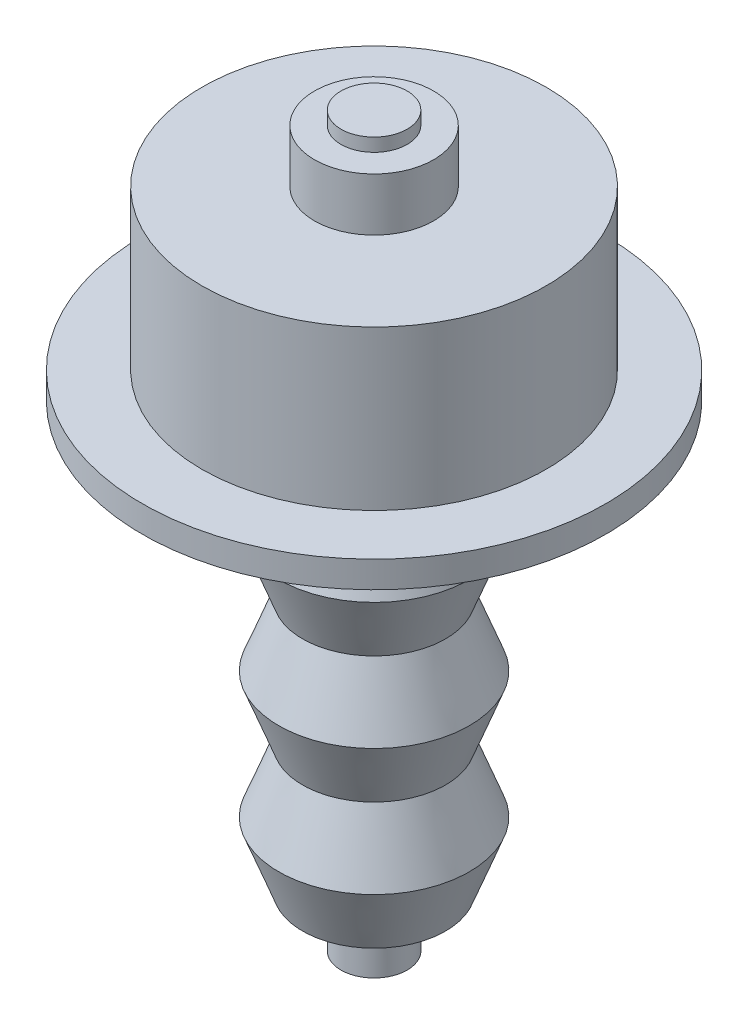
ISO-10303-21;
HEADER;
FILE_DESCRIPTION(('STEP AP214'),'2;1');
FILE_NAME('part.step','',(''),(''),'','','');
FILE_SCHEMA(('AUTOMOTIVE_DESIGN { 1 0 10303 214 1 1 1 1 }'));
ENDSEC;
DATA;
#1=APPLICATION_CONTEXT('core data for automotive mechanical design processes');
#2=APPLICATION_PROTOCOL_DEFINITION('international standard','automotive_design',2000,#1);
#3=PRODUCT_CONTEXT('',#1,'mechanical');
#4=PRODUCT('Part','Part','',(#3));
#5=PRODUCT_RELATED_PRODUCT_CATEGORY('part','',(#4));
#6=PRODUCT_DEFINITION_FORMATION('','',#4);
#7=PRODUCT_DEFINITION_CONTEXT('part definition',#1,'design');
#8=PRODUCT_DEFINITION('design','',#6,#7);
#9=PRODUCT_DEFINITION_SHAPE('','',#8);
#10=(LENGTH_UNIT() NAMED_UNIT(*) SI_UNIT(.MILLI.,.METRE.));
#11=(NAMED_UNIT(*) PLANE_ANGLE_UNIT() SI_UNIT($,.RADIAN.));
#12=(NAMED_UNIT(*) SI_UNIT($,.STERADIAN.) SOLID_ANGLE_UNIT());
#13=UNCERTAINTY_MEASURE_WITH_UNIT(LENGTH_MEASURE(1.E-05),#10,'distance_accuracy_value','');
#14=(GEOMETRIC_REPRESENTATION_CONTEXT(3) GLOBAL_UNCERTAINTY_ASSIGNED_CONTEXT((#13)) GLOBAL_UNIT_ASSIGNED_CONTEXT((#10,
#11,#12)) REPRESENTATION_CONTEXT('',''));
#15=CARTESIAN_POINT('',(0.,0.,0.));
#16=DIRECTION('',(0.,0.,1.));
#17=DIRECTION('',(1.,0.,0.));
#18=AXIS2_PLACEMENT_3D('',#15,#16,#17);
#19=CARTESIAN_POINT('',(0.,4.,0.));
#20=DIRECTION('',(0.,-1.,0.));
#21=DIRECTION('',(0.,0.,-1.));
#22=AXIS2_PLACEMENT_3D('',#19,#20,#21);
#23=PLANE('',#22);
#24=CARTESIAN_POINT('',(0.,4.,0.));
#25=DIRECTION('',(0.,-1.,0.));
#26=DIRECTION('',(0.,0.,-1.));
#27=AXIS2_PLACEMENT_3D('',#24,#25,#26);
#28=CIRCLE('',#27,2.5);
#29=CARTESIAN_POINT('',(0.,4.,-2.5));
#30=VERTEX_POINT('',#29);
#31=EDGE_CURVE('E73',#30,#30,#28,.F.);
#32=ORIENTED_EDGE('',*,*,#31,.T.);
#33=EDGE_LOOP('',(#32));
#34=FACE_BOUND('',#33,.T.);
#35=CARTESIAN_POINT('',(0.,4.,0.));
#36=DIRECTION('',(0.,-1.,0.));
#37=DIRECTION('',(0.,0.,-1.));
#38=AXIS2_PLACEMENT_3D('',#35,#36,#37);
#39=CIRCLE('',#38,5.4);
#40=CARTESIAN_POINT('',(0.,4.,-5.4));
#41=VERTEX_POINT('',#40);
#42=EDGE_CURVE('E10',#41,#41,#39,.T.);
#43=ORIENTED_EDGE('',*,*,#42,.T.);
#44=EDGE_LOOP('',(#43));
#45=FACE_BOUND('',#44,.T.);
#46=ADVANCED_FACE('F41',(#34,#45),#23,.T.);
#47=CARTESIAN_POINT('',(0.,4.,0.));
#48=DIRECTION('',(0.,1.,0.));
#49=DIRECTION('',(0.,0.,1.));
#50=AXIS2_PLACEMENT_3D('',#47,#48,#49);
#51=CONICAL_SURFACE('',#50,5.4,0.360283597779354);
#52=CARTESIAN_POINT('',(0.,8.778,0.));
#53=DIRECTION('',(0.,-1.,0.));
#54=DIRECTION('',(0.,0.,-1.));
#55=AXIS2_PLACEMENT_3D('',#52,#53,#54);
#56=CIRCLE('',#55,7.2);
#57=CARTESIAN_POINT('',(0.,8.778,-7.2));
#58=VERTEX_POINT('',#57);
#59=EDGE_CURVE('E48',#58,#58,#56,.T.);
#60=ORIENTED_EDGE('',*,*,#59,.T.);
#61=EDGE_LOOP('',(#60));
#62=FACE_BOUND('',#61,.T.);
#63=ORIENTED_EDGE('',*,*,#42,.F.);
#64=EDGE_LOOP('',(#63));
#65=FACE_BOUND('',#64,.T.);
#66=ADVANCED_FACE('F135',(#62,#65),#51,.T.);
#67=CARTESIAN_POINT('',(0.,8.778,0.));
#68=DIRECTION('',(0.,-1.,0.));
#69=DIRECTION('',(0.,0.,-1.));
#70=AXIS2_PLACEMENT_3D('',#67,#68,#69);
#71=CONICAL_SURFACE('',#70,7.2,0.360283597779354);
#72=CARTESIAN_POINT('',(0.,13.556,0.));
#73=DIRECTION('',(0.,-1.,0.));
#74=DIRECTION('',(0.,0.,-1.));
#75=AXIS2_PLACEMENT_3D('',#72,#73,#74);
#76=CIRCLE('',#75,5.4);
#77=CARTESIAN_POINT('',(0.,13.556,-5.4));
#78=VERTEX_POINT('',#77);
#79=EDGE_CURVE('E55',#78,#78,#76,.T.);
#80=ORIENTED_EDGE('',*,*,#79,.T.);
#81=EDGE_LOOP('',(#80));
#82=FACE_BOUND('',#81,.T.);
#83=ORIENTED_EDGE('',*,*,#59,.F.);
#84=EDGE_LOOP('',(#83));
#85=FACE_BOUND('',#84,.T.);
#86=ADVANCED_FACE('F139',(#82,#85),#71,.T.);
#87=CARTESIAN_POINT('',(0.,13.556,0.));
#88=DIRECTION('',(0.,1.,0.));
#89=DIRECTION('',(0.,0.,1.));
#90=AXIS2_PLACEMENT_3D('',#87,#88,#89);
#91=CONICAL_SURFACE('',#90,5.4,0.360352657212022);
#92=CARTESIAN_POINT('',(0.,18.333,0.));
#93=DIRECTION('',(0.,-1.,0.));
#94=DIRECTION('',(0.,0.,-1.));
#95=AXIS2_PLACEMENT_3D('',#92,#93,#94);
#96=CIRCLE('',#95,7.2);
#97=CARTESIAN_POINT('',(0.,18.333,-7.2));
#98=VERTEX_POINT('',#97);
#99=EDGE_CURVE('E60',#98,#98,#96,.T.);
#100=ORIENTED_EDGE('',*,*,#99,.T.);
#101=EDGE_LOOP('',(#100));
#102=FACE_BOUND('',#101,.T.);
#103=ORIENTED_EDGE('',*,*,#79,.F.);
#104=EDGE_LOOP('',(#103));
#105=FACE_BOUND('',#104,.T.);
#106=ADVANCED_FACE('F184',(#102,#105),#91,.T.);
#107=CARTESIAN_POINT('',(0.,18.333,0.));
#108=DIRECTION('',(0.,-1.,0.));
#109=DIRECTION('',(0.,0.,-1.));
#110=AXIS2_PLACEMENT_3D('',#107,#108,#109);
#111=CONICAL_SURFACE('',#110,7.2,0.360283597779354);
#112=CARTESIAN_POINT('',(0.,23.111,0.));
#113=DIRECTION('',(0.,-1.,0.));
#114=DIRECTION('',(0.,0.,-1.));
#115=AXIS2_PLACEMENT_3D('',#112,#113,#114);
#116=CIRCLE('',#115,5.4);
#117=CARTESIAN_POINT('',(0.,23.111,-5.4));
#118=VERTEX_POINT('',#117);
#119=EDGE_CURVE('E58',#118,#118,#116,.T.);
#120=ORIENTED_EDGE('',*,*,#119,.T.);
#121=EDGE_LOOP('',(#120));
#122=FACE_BOUND('',#121,.T.);
#123=ORIENTED_EDGE('',*,*,#99,.F.);
#124=EDGE_LOOP('',(#123));
#125=FACE_BOUND('',#124,.T.);
#126=ADVANCED_FACE('F180',(#122,#125),#111,.T.);
#127=CARTESIAN_POINT('',(0.,23.111,0.));
#128=DIRECTION('',(0.,1.,0.));
#129=DIRECTION('',(0.,0.,1.));
#130=AXIS2_PLACEMENT_3D('',#127,#128,#129);
#131=CONICAL_SURFACE('',#130,5.4,0.360283597779354);
#132=CARTESIAN_POINT('',(0.,27.889,0.));
#133=DIRECTION('',(0.,-1.,0.));
#134=DIRECTION('',(0.,0.,-1.));
#135=AXIS2_PLACEMENT_3D('',#132,#133,#134);
#136=CIRCLE('',#135,7.2);
#137=CARTESIAN_POINT('',(0.,27.889,-7.2));
#138=VERTEX_POINT('',#137);
#139=EDGE_CURVE('E65',#138,#138,#136,.T.);
#140=ORIENTED_EDGE('',*,*,#139,.T.);
#141=EDGE_LOOP('',(#140));
#142=FACE_BOUND('',#141,.T.);
#143=ORIENTED_EDGE('',*,*,#119,.F.);
#144=EDGE_LOOP('',(#143));
#145=FACE_BOUND('',#144,.T.);
#146=ADVANCED_FACE('F176',(#142,#145),#131,.T.);
#147=CARTESIAN_POINT('',(0.,27.889,0.));
#148=DIRECTION('',(0.,-1.,0.));
#149=DIRECTION('',(0.,0.,-1.));
#150=AXIS2_PLACEMENT_3D('',#147,#148,#149);
#151=CONICAL_SURFACE('',#150,7.2,0.360283597779354);
#152=CARTESIAN_POINT('',(0.,32.667,0.));
#153=DIRECTION('',(0.,-1.,0.));
#154=DIRECTION('',(0.,0.,-1.));
#155=AXIS2_PLACEMENT_3D('',#152,#153,#154);
#156=CIRCLE('',#155,5.4);
#157=CARTESIAN_POINT('',(0.,32.667,-5.4));
#158=VERTEX_POINT('',#157);
#159=EDGE_CURVE('E66',#158,#158,#156,.T.);
#160=ORIENTED_EDGE('',*,*,#159,.T.);
#161=EDGE_LOOP('',(#160));
#162=FACE_BOUND('',#161,.T.);
#163=ORIENTED_EDGE('',*,*,#139,.F.);
#164=EDGE_LOOP('',(#163));
#165=FACE_BOUND('',#164,.T.);
#166=ADVANCED_FACE('F171',(#162,#165),#151,.T.);
#167=CARTESIAN_POINT('',(0.,32.667,0.));
#168=DIRECTION('',(0.,1.,0.));
#169=DIRECTION('',(0.,0.,1.));
#170=AXIS2_PLACEMENT_3D('',#167,#168,#169);
#171=CONICAL_SURFACE('',#170,5.4,0.360352657212022);
#172=CARTESIAN_POINT('',(0.,37.444,0.));
#173=DIRECTION('',(0.,-1.,0.));
#174=DIRECTION('',(0.,0.,-1.));
#175=AXIS2_PLACEMENT_3D('',#172,#173,#174);
#176=CIRCLE('',#175,7.2);
#177=CARTESIAN_POINT('',(0.,37.444,-7.2));
#178=VERTEX_POINT('',#177);
#179=EDGE_CURVE('E68',#178,#178,#176,.T.);
#180=ORIENTED_EDGE('',*,*,#179,.T.);
#181=EDGE_LOOP('',(#180));
#182=FACE_BOUND('',#181,.T.);
#183=ORIENTED_EDGE('',*,*,#159,.F.);
#184=EDGE_LOOP('',(#183));
#185=FACE_BOUND('',#184,.T.);
#186=ADVANCED_FACE('F169',(#182,#185),#171,.T.);
#187=CARTESIAN_POINT('',(0.,37.444,0.));
#188=DIRECTION('',(0.,-1.,0.));
#189=DIRECTION('',(0.,0.,-1.));
#190=AXIS2_PLACEMENT_3D('',#187,#188,#189);
#191=CONICAL_SURFACE('',#190,7.2,0.360283597779354);
#192=CARTESIAN_POINT('',(0.,42.222,0.));
#193=DIRECTION('',(0.,-1.,0.));
#194=DIRECTION('',(0.,0.,-1.));
#195=AXIS2_PLACEMENT_3D('',#192,#193,#194);
#196=CIRCLE('',#195,5.4);
#197=CARTESIAN_POINT('',(0.,42.222,-5.4));
#198=VERTEX_POINT('',#197);
#199=EDGE_CURVE('E75',#198,#198,#196,.T.);
#200=ORIENTED_EDGE('',*,*,#199,.T.);
#201=EDGE_LOOP('',(#200));
#202=FACE_BOUND('',#201,.T.);
#203=ORIENTED_EDGE('',*,*,#179,.F.);
#204=EDGE_LOOP('',(#203));
#205=FACE_BOUND('',#204,.T.);
#206=ADVANCED_FACE('F163',(#202,#205),#191,.T.);
#207=CARTESIAN_POINT('',(0.,42.222,0.));
#208=DIRECTION('',(0.,1.,0.));
#209=DIRECTION('',(0.,0.,1.));
#210=AXIS2_PLACEMENT_3D('',#207,#208,#209);
#211=CONICAL_SURFACE('',#210,5.4,0.360283597779354);
#212=CARTESIAN_POINT('',(0.,47.,0.));
#213=DIRECTION('',(0.,-1.,0.));
#214=DIRECTION('',(0.,0.,-1.));
#215=AXIS2_PLACEMENT_3D('',#212,#213,#214);
#216=CIRCLE('',#215,7.2);
#217=CARTESIAN_POINT('',(0.,47.,-7.2));
#218=VERTEX_POINT('',#217);
#219=EDGE_CURVE('E82',#218,#218,#216,.F.);
#220=ORIENTED_EDGE('',*,*,#219,.F.);
#221=EDGE_LOOP('',(#220));
#222=FACE_BOUND('',#221,.T.);
#223=ORIENTED_EDGE('',*,*,#199,.F.);
#224=EDGE_LOOP('',(#223));
#225=FACE_BOUND('',#224,.T.);
#226=ADVANCED_FACE('F148',(#222,#225),#211,.T.);
#227=CARTESIAN_POINT('',(0.,55.,0.));
#228=DIRECTION('',(0.,-1.,0.));
#229=DIRECTION('',(0.,0.,-1.));
#230=AXIS2_PLACEMENT_3D('',#227,#228,#229);
#231=CYLINDRICAL_SURFACE('',#230,2.5);
#232=ORIENTED_EDGE('',*,*,#31,.F.);
#233=EDGE_LOOP('',(#232));
#234=FACE_BOUND('',#233,.T.);
#235=CARTESIAN_POINT('',(0.,0.,0.));
#236=DIRECTION('',(0.,1.,0.));
#237=DIRECTION('',(0.,0.,1.));
#238=AXIS2_PLACEMENT_3D('',#235,#236,#237);
#239=CIRCLE('',#238,2.5);
#240=CARTESIAN_POINT('',(0.,0.,2.5));
#241=VERTEX_POINT('',#240);
#242=EDGE_CURVE('E78',#241,#241,#239,.T.);
#243=ORIENTED_EDGE('',*,*,#242,.T.);
#244=EDGE_LOOP('',(#243));
#245=FACE_BOUND('',#244,.T.);
#246=ADVANCED_FACE('F142',(#234,#245),#231,.T.);
#247=CARTESIAN_POINT('',(0.,0.,0.));
#248=DIRECTION('',(0.,1.,0.));
#249=DIRECTION('',(0.,0.,1.));
#250=AXIS2_PLACEMENT_3D('',#247,#248,#249);
#251=PLANE('',#250);
#252=ORIENTED_EDGE('',*,*,#242,.F.);
#253=EDGE_LOOP('',(#252));
#254=FACE_BOUND('',#253,.T.);
#255=ADVANCED_FACE('F144',(#254),#251,.F.);
#256=CARTESIAN_POINT('',(0.,47.,0.));
#257=DIRECTION('',(0.,-1.,0.));
#258=DIRECTION('',(0.,0.,-1.));
#259=AXIS2_PLACEMENT_3D('',#256,#257,#258);
#260=PLANE('',#259);
#261=CARTESIAN_POINT('',(0.,47.,0.));
#262=DIRECTION('',(0.,-1.,0.));
#263=DIRECTION('',(0.,0.,-1.));
#264=AXIS2_PLACEMENT_3D('',#261,#262,#263);
#265=CIRCLE('',#264,9.5);
#266=CARTESIAN_POINT('',(0.,47.,-9.5));
#267=VERTEX_POINT('',#266);
#268=EDGE_CURVE('E105',#267,#267,#265,.T.);
#269=ORIENTED_EDGE('',*,*,#268,.T.);
#270=EDGE_LOOP('',(#269));
#271=FACE_BOUND('',#270,.T.);
#272=ORIENTED_EDGE('',*,*,#219,.T.);
#273=EDGE_LOOP('',(#272));
#274=FACE_BOUND('',#273,.T.);
#275=ADVANCED_FACE('F151',(#271,#274),#260,.T.);
#276=CARTESIAN_POINT('',(0.,31.,0.));
#277=DIRECTION('',(0.,-1.,0.));
#278=DIRECTION('',(0.,0.,-1.));
#279=AXIS2_PLACEMENT_3D('',#276,#277,#278);
#280=CYLINDRICAL_SURFACE('',#279,9.5);
#281=CARTESIAN_POINT('',(0.,36.,0.));
#282=DIRECTION('',(0.,-1.,0.));
#283=DIRECTION('',(0.,0.,-1.));
#284=AXIS2_PLACEMENT_3D('',#281,#282,#283);
#285=CIRCLE('',#284,9.5);
#286=CARTESIAN_POINT('',(0.,36.,-9.5));
#287=VERTEX_POINT('',#286);
#288=EDGE_CURVE('E87',#287,#287,#285,.T.);
#289=ORIENTED_EDGE('',*,*,#288,.T.);
#290=EDGE_LOOP('',(#289));
#291=FACE_BOUND('',#290,.T.);
#292=ORIENTED_EDGE('',*,*,#268,.F.);
#293=EDGE_LOOP('',(#292));
#294=FACE_BOUND('',#293,.T.);
#295=ADVANCED_FACE('F156',(#291,#294),#280,.F.);
#296=CARTESIAN_POINT('',(9.5,36.,0.));
#297=DIRECTION('',(0.,-1.,0.));
#298=DIRECTION('',(0.,0.,-1.));
#299=AXIS2_PLACEMENT_3D('',#296,#297,#298);
#300=PLANE('',#299);
#301=CARTESIAN_POINT('',(0.,36.,0.));
#302=DIRECTION('',(0.,-1.,0.));
#303=DIRECTION('',(0.,0.,-1.));
#304=AXIS2_PLACEMENT_3D('',#301,#302,#303);
#305=CIRCLE('',#304,17.5);
#306=CARTESIAN_POINT('',(0.,36.,-17.5));
#307=VERTEX_POINT('',#306);
#308=EDGE_CURVE('E89',#307,#307,#305,.T.);
#309=ORIENTED_EDGE('',*,*,#308,.T.);
#310=EDGE_LOOP('',(#309));
#311=FACE_BOUND('',#310,.T.);
#312=ORIENTED_EDGE('',*,*,#288,.F.);
#313=EDGE_LOOP('',(#312));
#314=FACE_BOUND('',#313,.T.);
#315=ADVANCED_FACE('F252',(#311,#314),#300,.T.);
#316=CARTESIAN_POINT('',(0.,31.,0.));
#317=DIRECTION('',(0.,-1.,0.));
#318=DIRECTION('',(0.,0.,-1.));
#319=AXIS2_PLACEMENT_3D('',#316,#317,#318);
#320=CYLINDRICAL_SURFACE('',#319,17.5);
#321=CARTESIAN_POINT('',(0.,38.,0.));
#322=DIRECTION('',(0.,-1.,0.));
#323=DIRECTION('',(0.,0.,-1.));
#324=AXIS2_PLACEMENT_3D('',#321,#322,#323);
#325=CIRCLE('',#324,17.5);
#326=CARTESIAN_POINT('',(0.,38.,-17.5));
#327=VERTEX_POINT('',#326);
#328=EDGE_CURVE('E91',#327,#327,#325,.T.);
#329=ORIENTED_EDGE('',*,*,#328,.T.);
#330=EDGE_LOOP('',(#329));
#331=FACE_BOUND('',#330,.T.);
#332=ORIENTED_EDGE('',*,*,#308,.F.);
#333=EDGE_LOOP('',(#332));
#334=FACE_BOUND('',#333,.T.);
#335=ADVANCED_FACE('F261',(#331,#334),#320,.T.);
#336=CARTESIAN_POINT('',(17.5,38.,0.));
#337=DIRECTION('',(0.,1.,0.));
#338=DIRECTION('',(0.,0.,1.));
#339=AXIS2_PLACEMENT_3D('',#336,#337,#338);
#340=PLANE('',#339);
#341=CARTESIAN_POINT('',(0.,38.,0.));
#342=DIRECTION('',(0.,-1.,0.));
#343=DIRECTION('',(0.,0.,-1.));
#344=AXIS2_PLACEMENT_3D('',#341,#342,#343);
#345=CIRCLE('',#344,13.);
#346=CARTESIAN_POINT('',(0.,38.,-13.));
#347=VERTEX_POINT('',#346);
#348=EDGE_CURVE('E96',#347,#347,#345,.T.);
#349=ORIENTED_EDGE('',*,*,#348,.T.);
#350=EDGE_LOOP('',(#349));
#351=FACE_BOUND('',#350,.T.);
#352=ORIENTED_EDGE('',*,*,#328,.F.);
#353=EDGE_LOOP('',(#352));
#354=FACE_BOUND('',#353,.T.);
#355=ADVANCED_FACE('F271',(#351,#354),#340,.T.);
#356=CARTESIAN_POINT('',(0.,31.,0.));
#357=DIRECTION('',(0.,-1.,0.));
#358=DIRECTION('',(0.,0.,-1.));
#359=AXIS2_PLACEMENT_3D('',#356,#357,#358);
#360=CYLINDRICAL_SURFACE('',#359,13.);
#361=CARTESIAN_POINT('',(0.,50.,0.));
#362=DIRECTION('',(0.,-1.,0.));
#363=DIRECTION('',(0.,0.,-1.));
#364=AXIS2_PLACEMENT_3D('',#361,#362,#363);
#365=CIRCLE('',#364,13.);
#366=CARTESIAN_POINT('',(0.,50.,-13.));
#367=VERTEX_POINT('',#366);
#368=EDGE_CURVE('E97',#367,#367,#365,.T.);
#369=ORIENTED_EDGE('',*,*,#368,.T.);
#370=EDGE_LOOP('',(#369));
#371=FACE_BOUND('',#370,.T.);
#372=ORIENTED_EDGE('',*,*,#348,.F.);
#373=EDGE_LOOP('',(#372));
#374=FACE_BOUND('',#373,.T.);
#375=ADVANCED_FACE('F284',(#371,#374),#360,.T.);
#376=CARTESIAN_POINT('',(13.,50.,0.));
#377=DIRECTION('',(0.,1.,0.));
#378=DIRECTION('',(0.,0.,1.));
#379=AXIS2_PLACEMENT_3D('',#376,#377,#378);
#380=PLANE('',#379);
#381=CARTESIAN_POINT('',(0.,50.,0.));
#382=DIRECTION('',(0.,1.,0.));
#383=DIRECTION('',(0.,0.,1.));
#384=AXIS2_PLACEMENT_3D('',#381,#382,#383);
#385=CIRCLE('',#384,4.5);
#386=CARTESIAN_POINT('',(0.,50.,4.5));
#387=VERTEX_POINT('',#386);
#388=EDGE_CURVE('E104',#387,#387,#385,.T.);
#389=ORIENTED_EDGE('',*,*,#388,.F.);
#390=EDGE_LOOP('',(#389));
#391=FACE_BOUND('',#390,.T.);
#392=ORIENTED_EDGE('',*,*,#368,.F.);
#393=EDGE_LOOP('',(#392));
#394=FACE_BOUND('',#393,.T.);
#395=ADVANCED_FACE('F129',(#391,#394),#380,.T.);
#396=CARTESIAN_POINT('',(0.,54.,0.));
#397=DIRECTION('',(0.,-1.,0.));
#398=DIRECTION('',(0.,0.,-1.));
#399=AXIS2_PLACEMENT_3D('',#396,#397,#398);
#400=CYLINDRICAL_SURFACE('',#399,4.5);
#401=CARTESIAN_POINT('',(0.,54.,0.));
#402=DIRECTION('',(0.,1.,0.));
#403=DIRECTION('',(0.,0.,1.));
#404=AXIS2_PLACEMENT_3D('',#401,#402,#403);
#405=CIRCLE('',#404,4.5);
#406=CARTESIAN_POINT('',(0.,54.,4.5));
#407=VERTEX_POINT('',#406);
#408=EDGE_CURVE('E107',#407,#407,#405,.T.);
#409=ORIENTED_EDGE('',*,*,#408,.F.);
#410=EDGE_LOOP('',(#409));
#411=FACE_BOUND('',#410,.T.);
#412=ORIENTED_EDGE('',*,*,#388,.T.);
#413=EDGE_LOOP('',(#412));
#414=FACE_BOUND('',#413,.T.);
#415=ADVANCED_FACE('F121',(#411,#414),#400,.T.);
#416=CARTESIAN_POINT('',(0.,54.,0.));
#417=DIRECTION('',(0.,1.,0.));
#418=DIRECTION('',(0.,0.,1.));
#419=AXIS2_PLACEMENT_3D('',#416,#417,#418);
#420=PLANE('',#419);
#421=CARTESIAN_POINT('',(0.,54.,0.));
#422=DIRECTION('',(0.,1.,0.));
#423=DIRECTION('',(0.,0.,1.));
#424=AXIS2_PLACEMENT_3D('',#421,#422,#423);
#425=CIRCLE('',#424,2.5);
#426=CARTESIAN_POINT('',(0.,54.,2.5));
#427=VERTEX_POINT('',#426);
#428=EDGE_CURVE('E42',#427,#427,#425,.T.);
#429=ORIENTED_EDGE('',*,*,#428,.F.);
#430=EDGE_LOOP('',(#429));
#431=FACE_BOUND('',#430,.T.);
#432=ORIENTED_EDGE('',*,*,#408,.T.);
#433=EDGE_LOOP('',(#432));
#434=FACE_BOUND('',#433,.T.);
#435=ADVANCED_FACE('F120',(#431,#434),#420,.T.);
#436=CARTESIAN_POINT('',(0.,55.,0.));
#437=DIRECTION('',(0.,1.,0.));
#438=DIRECTION('',(0.,0.,1.));
#439=AXIS2_PLACEMENT_3D('',#436,#437,#438);
#440=PLANE('',#439);
#441=CARTESIAN_POINT('',(0.,55.,0.));
#442=DIRECTION('',(0.,1.,0.));
#443=DIRECTION('',(0.,0.,1.));
#444=AXIS2_PLACEMENT_3D('',#441,#442,#443);
#445=CIRCLE('',#444,2.5);
#446=CARTESIAN_POINT('',(0.,55.,2.5));
#447=VERTEX_POINT('',#446);
#448=EDGE_CURVE('E80',#447,#447,#445,.T.);
#449=ORIENTED_EDGE('',*,*,#448,.T.);
#450=EDGE_LOOP('',(#449));
#451=FACE_BOUND('',#450,.T.);
#452=ADVANCED_FACE('F117',(#451),#440,.T.);
#453=ORIENTED_EDGE('',*,*,#428,.T.);
#454=EDGE_LOOP('',(#453));
#455=FACE_BOUND('',#454,.T.);
#456=ORIENTED_EDGE('',*,*,#448,.F.);
#457=EDGE_LOOP('',(#456));
#458=FACE_BOUND('',#457,.T.);
#459=ADVANCED_FACE('F113',(#455,#458),#231,.T.);
#460=CLOSED_SHELL('',(#46,#66,#86,#106,#126,#146,#166,#186,#206,#226,#246,#255,#275,#295,#315,
#335,#355,#375,#395,#415,#435,#452,#459));
#461=MANIFOLD_SOLID_BREP('B2',#460);
#462=ADVANCED_BREP_SHAPE_REPRESENTATION('',(#18,#461),#14);
#463=SHAPE_DEFINITION_REPRESENTATION(#9,#462);
ENDSEC;
END-ISO-10303-21;
